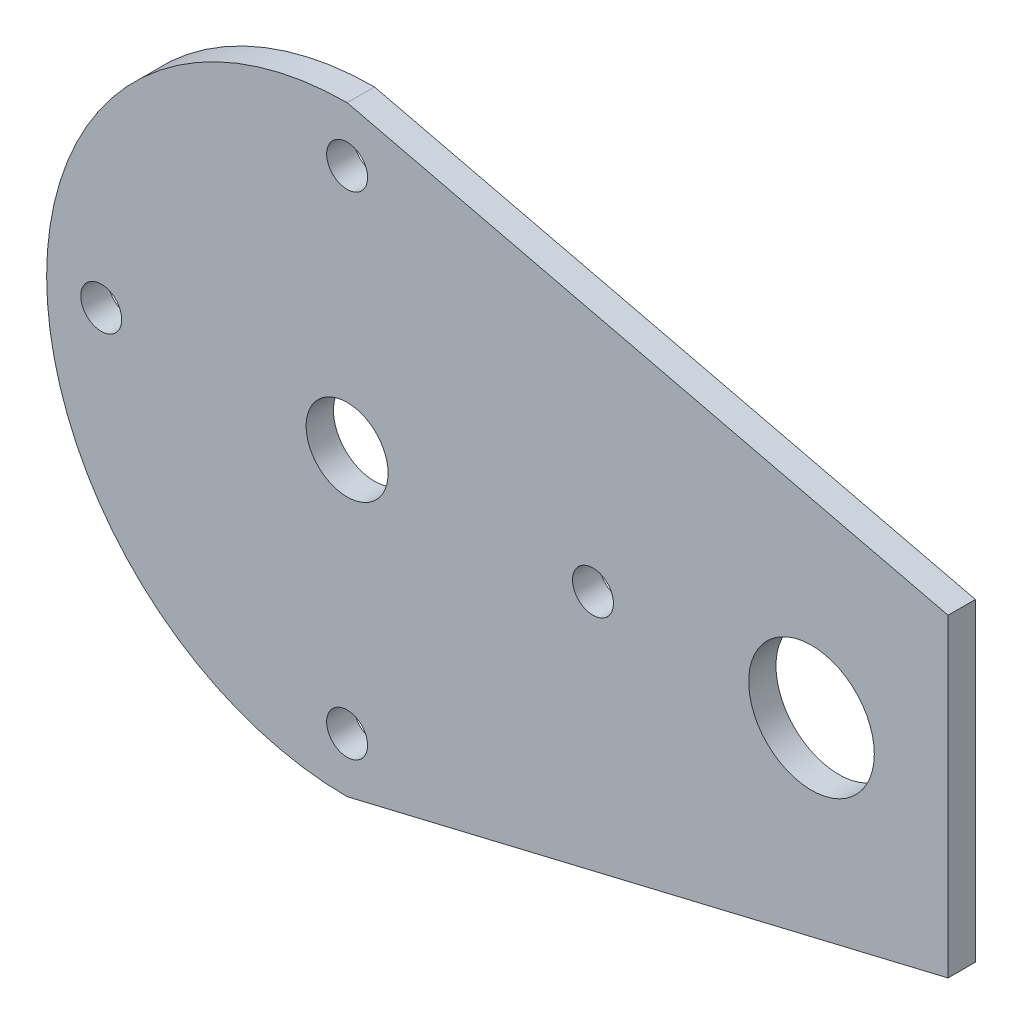
ISO-10303-21;
HEADER;
FILE_DESCRIPTION(('STEP AP214'),'2;1');
FILE_NAME('part.step','',(''),(''),'','','');
FILE_SCHEMA(('AUTOMOTIVE_DESIGN { 1 0 10303 214 1 1 1 1 }'));
ENDSEC;
DATA;
#1=APPLICATION_CONTEXT('core data for automotive mechanical design processes');
#2=APPLICATION_PROTOCOL_DEFINITION('international standard','automotive_design',2000,#1);
#3=PRODUCT_CONTEXT('',#1,'mechanical');
#4=PRODUCT('Part','Part','',(#3));
#5=PRODUCT_RELATED_PRODUCT_CATEGORY('part','',(#4));
#6=PRODUCT_DEFINITION_FORMATION('','',#4);
#7=PRODUCT_DEFINITION_CONTEXT('part definition',#1,'design');
#8=PRODUCT_DEFINITION('design','',#6,#7);
#9=PRODUCT_DEFINITION_SHAPE('','',#8);
#10=(LENGTH_UNIT() NAMED_UNIT(*) SI_UNIT(.MILLI.,.METRE.));
#11=(NAMED_UNIT(*) PLANE_ANGLE_UNIT() SI_UNIT($,.RADIAN.));
#12=(NAMED_UNIT(*) SI_UNIT($,.STERADIAN.) SOLID_ANGLE_UNIT());
#13=UNCERTAINTY_MEASURE_WITH_UNIT(LENGTH_MEASURE(1.E-05),#10,'distance_accuracy_value','');
#14=(GEOMETRIC_REPRESENTATION_CONTEXT(3) GLOBAL_UNCERTAINTY_ASSIGNED_CONTEXT((#13)) GLOBAL_UNIT_ASSIGNED_CONTEXT((#10,
#11,#12)) REPRESENTATION_CONTEXT('',''));
#15=CARTESIAN_POINT('',(0.,0.,0.));
#16=DIRECTION('',(0.,0.,1.));
#17=DIRECTION('',(1.,0.,0.));
#18=AXIS2_PLACEMENT_3D('',#15,#16,#17);
#19=CARTESIAN_POINT('',(2.86640368944242,12.010447034107,2.));
#20=DIRECTION('',(-0.232139621887318,-0.972682474371782,0.));
#21=DIRECTION('',(0.972682474371782,-0.232139621887318,0.));
#22=AXIS2_PLACEMENT_3D('',#19,#20,#21);
#23=PLANE('',#22);
#24=DIRECTION('',(-0.972682474371782,0.232139621887318,0.));
#25=VECTOR('',#24,1.);
#26=CARTESIAN_POINT('',(2.86640368944242,12.010447034107,0.));
#27=LINE('',#26,#25);
#28=CARTESIAN_POINT('',(5.00100483165142,11.5010048316527,0.));
#29=VERTEX_POINT('',#28);
#30=CARTESIAN_POINT('',(-38.9989951683486,22.0020096633054,0.));
#31=VERTEX_POINT('',#30);
#32=EDGE_CURVE('E119',#29,#31,#27,.T.);
#33=ORIENTED_EDGE('',*,*,#32,.T.);
#34=DIRECTION('',(0.,0.,-1.));
#35=VECTOR('',#34,1.);
#36=CARTESIAN_POINT('',(-38.9989951683486,22.0020096633054,2.));
#37=LINE('',#36,#35);
#38=CARTESIAN_POINT('',(-38.9989951683486,22.0020096633054,2.));
#39=VERTEX_POINT('',#38);
#40=EDGE_CURVE('E11',#39,#31,#37,.T.);
#41=ORIENTED_EDGE('',*,*,#40,.F.);
#42=DIRECTION('',(-0.972682474371782,0.232139621887318,0.));
#43=VECTOR('',#42,1.);
#44=CARTESIAN_POINT('',(2.86640368944242,12.010447034107,2.));
#45=LINE('',#44,#43);
#46=CARTESIAN_POINT('',(5.00100483165142,11.5010048316527,2.));
#47=VERTEX_POINT('',#46);
#48=EDGE_CURVE('E87',#47,#39,#45,.T.);
#49=ORIENTED_EDGE('',*,*,#48,.F.);
#50=DIRECTION('',(0.,0.,-1.));
#51=VECTOR('',#50,1.);
#52=CARTESIAN_POINT('',(5.00100483165142,11.5010048316527,2.));
#53=LINE('',#52,#51);
#54=EDGE_CURVE('E54',#47,#29,#53,.T.);
#55=ORIENTED_EDGE('',*,*,#54,.T.);
#56=EDGE_LOOP('',(#33,#41,#49,#55));
#57=FACE_BOUND('',#56,.T.);
#58=ADVANCED_FACE('F37',(#57),#23,.F.);
#59=CARTESIAN_POINT('',(-38.9989951683486,0.,2.));
#60=DIRECTION('',(0.,0.,-1.));
#61=DIRECTION('',(-1.,0.,0.));
#62=AXIS2_PLACEMENT_3D('',#59,#60,#61);
#63=CYLINDRICAL_SURFACE('',#62,22.0020096633054);
#64=CARTESIAN_POINT('',(-38.9989951683486,0.,0.));
#65=DIRECTION('',(0.,0.,1.));
#66=DIRECTION('',(1.,0.,0.));
#67=AXIS2_PLACEMENT_3D('',#64,#65,#66);
#68=CIRCLE('',#67,22.0020096633054);
#69=CARTESIAN_POINT('',(-38.9989951683486,-22.0020096633054,0.));
#70=VERTEX_POINT('',#69);
#71=EDGE_CURVE('E92',#31,#70,#68,.T.);
#72=ORIENTED_EDGE('',*,*,#71,.T.);
#73=DIRECTION('',(0.,0.,-1.));
#74=VECTOR('',#73,1.);
#75=CARTESIAN_POINT('',(-38.9989951683486,-22.0020096633054,2.));
#76=LINE('',#75,#74);
#77=CARTESIAN_POINT('',(-38.9989951683486,-22.0020096633054,2.));
#78=VERTEX_POINT('',#77);
#79=EDGE_CURVE('E46',#78,#70,#76,.T.);
#80=ORIENTED_EDGE('',*,*,#79,.F.);
#81=CARTESIAN_POINT('',(-38.9989951683486,0.,2.));
#82=DIRECTION('',(0.,0.,1.));
#83=DIRECTION('',(1.,0.,0.));
#84=AXIS2_PLACEMENT_3D('',#81,#82,#83);
#85=CIRCLE('',#84,22.0020096633054);
#86=EDGE_CURVE('E79',#39,#78,#85,.T.);
#87=ORIENTED_EDGE('',*,*,#86,.F.);
#88=ORIENTED_EDGE('',*,*,#40,.T.);
#89=EDGE_LOOP('',(#72,#80,#87,#88));
#90=FACE_BOUND('',#89,.T.);
#91=ADVANCED_FACE('F91',(#90),#63,.T.);
#92=CARTESIAN_POINT('',(2.86640368944242,-12.010447034107,2.));
#93=DIRECTION('',(0.232139621887318,-0.972682474371782,0.));
#94=DIRECTION('',(0.972682474371782,0.232139621887318,0.));
#95=AXIS2_PLACEMENT_3D('',#92,#93,#94);
#96=PLANE('',#95);
#97=DIRECTION('',(-0.972682474371782,-0.232139621887318,0.));
#98=VECTOR('',#97,1.);
#99=CARTESIAN_POINT('',(2.86640368944242,-12.010447034107,0.));
#100=LINE('',#99,#98);
#101=CARTESIAN_POINT('',(5.00100483165142,-11.5010048316527,0.));
#102=VERTEX_POINT('',#101);
#103=EDGE_CURVE('E122',#102,#70,#100,.T.);
#104=ORIENTED_EDGE('',*,*,#103,.F.);
#105=DIRECTION('',(0.,0.,-1.));
#106=VECTOR('',#105,1.);
#107=CARTESIAN_POINT('',(5.00100483165142,-11.5010048316527,2.));
#108=LINE('',#107,#106);
#109=CARTESIAN_POINT('',(5.00100483165142,-11.5010048316527,2.));
#110=VERTEX_POINT('',#109);
#111=EDGE_CURVE('E68',#110,#102,#108,.T.);
#112=ORIENTED_EDGE('',*,*,#111,.F.);
#113=DIRECTION('',(-0.972682474371782,-0.232139621887318,0.));
#114=VECTOR('',#113,1.);
#115=CARTESIAN_POINT('',(2.86640368944242,-12.010447034107,2.));
#116=LINE('',#115,#114);
#117=EDGE_CURVE('E86',#110,#78,#116,.T.);
#118=ORIENTED_EDGE('',*,*,#117,.T.);
#119=ORIENTED_EDGE('',*,*,#79,.T.);
#120=EDGE_LOOP('',(#104,#112,#118,#119));
#121=FACE_BOUND('',#120,.T.);
#122=ADVANCED_FACE('F95',(#121),#96,.T.);
#123=CARTESIAN_POINT('',(-38.9989951683486,0.,2.));
#124=DIRECTION('',(0.,0.,-1.));
#125=DIRECTION('',(-1.,0.,0.));
#126=AXIS2_PLACEMENT_3D('',#123,#124,#125);
#127=CYLINDRICAL_SURFACE('',#126,3.);
#128=CARTESIAN_POINT('',(-38.9989951683486,0.,2.));
#129=DIRECTION('',(0.,0.,1.));
#130=DIRECTION('',(1.,0.,0.));
#131=AXIS2_PLACEMENT_3D('',#128,#129,#130);
#132=CIRCLE('',#131,3.);
#133=CARTESIAN_POINT('',(-35.9989951683486,0.,2.));
#134=VERTEX_POINT('',#133);
#135=EDGE_CURVE('E147',#134,#134,#132,.T.);
#136=ORIENTED_EDGE('',*,*,#135,.T.);
#137=EDGE_LOOP('',(#136));
#138=FACE_BOUND('',#137,.T.);
#139=CARTESIAN_POINT('',(-38.9989951683486,0.,0.));
#140=DIRECTION('',(0.,0.,1.));
#141=DIRECTION('',(1.,0.,0.));
#142=AXIS2_PLACEMENT_3D('',#139,#140,#141);
#143=CIRCLE('',#142,3.);
#144=CARTESIAN_POINT('',(-35.9989951683486,0.,0.));
#145=VERTEX_POINT('',#144);
#146=EDGE_CURVE('E116',#145,#145,#143,.T.);
#147=ORIENTED_EDGE('',*,*,#146,.F.);
#148=EDGE_LOOP('',(#147));
#149=FACE_BOUND('',#148,.T.);
#150=ADVANCED_FACE('F151',(#138,#149),#127,.F.);
#151=CARTESIAN_POINT('',(-4.99899516834858,0.,2.));
#152=DIRECTION('',(0.,0.,-1.));
#153=DIRECTION('',(-1.,0.,0.));
#154=AXIS2_PLACEMENT_3D('',#151,#152,#153);
#155=CYLINDRICAL_SURFACE('',#154,4.6);
#156=CARTESIAN_POINT('',(-4.99899516834858,0.,2.));
#157=DIRECTION('',(0.,0.,1.));
#158=DIRECTION('',(1.,0.,0.));
#159=AXIS2_PLACEMENT_3D('',#156,#157,#158);
#160=CIRCLE('',#159,4.6);
#161=CARTESIAN_POINT('',(-0.398995168348585,0.,2.));
#162=VERTEX_POINT('',#161);
#163=EDGE_CURVE('E144',#162,#162,#160,.T.);
#164=ORIENTED_EDGE('',*,*,#163,.T.);
#165=EDGE_LOOP('',(#164));
#166=FACE_BOUND('',#165,.T.);
#167=CARTESIAN_POINT('',(-4.99899516834858,0.,0.));
#168=DIRECTION('',(0.,0.,1.));
#169=DIRECTION('',(1.,0.,0.));
#170=AXIS2_PLACEMENT_3D('',#167,#168,#169);
#171=CIRCLE('',#170,4.6);
#172=CARTESIAN_POINT('',(-0.398995168348585,0.,0.));
#173=VERTEX_POINT('',#172);
#174=EDGE_CURVE('E113',#173,#173,#171,.T.);
#175=ORIENTED_EDGE('',*,*,#174,.F.);
#176=EDGE_LOOP('',(#175));
#177=FACE_BOUND('',#176,.T.);
#178=ADVANCED_FACE('F177',(#166,#177),#155,.F.);
#179=CARTESIAN_POINT('',(-38.9989951683486,-18.0020096633054,2.));
#180=DIRECTION('',(0.,0.,-1.));
#181=DIRECTION('',(-1.,0.,0.));
#182=AXIS2_PLACEMENT_3D('',#179,#180,#181);
#183=CYLINDRICAL_SURFACE('',#182,1.5);
#184=CARTESIAN_POINT('',(-38.9989951683486,-18.0020096633054,2.));
#185=DIRECTION('',(0.,0.,1.));
#186=DIRECTION('',(1.,0.,0.));
#187=AXIS2_PLACEMENT_3D('',#184,#185,#186);
#188=CIRCLE('',#187,1.5);
#189=CARTESIAN_POINT('',(-37.4989951683486,-18.0020096633054,2.));
#190=VERTEX_POINT('',#189);
#191=EDGE_CURVE('E141',#190,#190,#188,.T.);
#192=ORIENTED_EDGE('',*,*,#191,.T.);
#193=EDGE_LOOP('',(#192));
#194=FACE_BOUND('',#193,.T.);
#195=CARTESIAN_POINT('',(-38.9989951683486,-18.0020096633054,0.));
#196=DIRECTION('',(0.,0.,1.));
#197=DIRECTION('',(1.,0.,0.));
#198=AXIS2_PLACEMENT_3D('',#195,#196,#197);
#199=CIRCLE('',#198,1.5);
#200=CARTESIAN_POINT('',(-37.4989951683486,-18.0020096633054,0.));
#201=VERTEX_POINT('',#200);
#202=EDGE_CURVE('E110',#201,#201,#199,.T.);
#203=ORIENTED_EDGE('',*,*,#202,.F.);
#204=EDGE_LOOP('',(#203));
#205=FACE_BOUND('',#204,.T.);
#206=ADVANCED_FACE('F180',(#194,#205),#183,.F.);
#207=CARTESIAN_POINT('',(-38.9989951683486,18.0020096633054,2.));
#208=DIRECTION('',(0.,0.,-1.));
#209=DIRECTION('',(-1.,0.,0.));
#210=AXIS2_PLACEMENT_3D('',#207,#208,#209);
#211=CYLINDRICAL_SURFACE('',#210,1.5);
#212=CARTESIAN_POINT('',(-38.9989951683486,18.0020096633054,2.));
#213=DIRECTION('',(0.,0.,1.));
#214=DIRECTION('',(1.,0.,0.));
#215=AXIS2_PLACEMENT_3D('',#212,#213,#214);
#216=CIRCLE('',#215,1.5);
#217=CARTESIAN_POINT('',(-37.4989951683486,18.0020096633054,2.));
#218=VERTEX_POINT('',#217);
#219=EDGE_CURVE('E136',#218,#218,#216,.T.);
#220=ORIENTED_EDGE('',*,*,#219,.T.);
#221=EDGE_LOOP('',(#220));
#222=FACE_BOUND('',#221,.T.);
#223=CARTESIAN_POINT('',(-38.9989951683486,18.0020096633054,0.));
#224=DIRECTION('',(0.,0.,1.));
#225=DIRECTION('',(1.,0.,0.));
#226=AXIS2_PLACEMENT_3D('',#223,#224,#225);
#227=CIRCLE('',#226,1.5);
#228=CARTESIAN_POINT('',(-37.4989951683486,18.0020096633054,0.));
#229=VERTEX_POINT('',#228);
#230=EDGE_CURVE('E107',#229,#229,#227,.T.);
#231=ORIENTED_EDGE('',*,*,#230,.F.);
#232=EDGE_LOOP('',(#231));
#233=FACE_BOUND('',#232,.T.);
#234=ADVANCED_FACE('F184',(#222,#233),#211,.F.);
#235=CARTESIAN_POINT('',(-57.001004831654,0.,2.));
#236=DIRECTION('',(0.,0.,-1.));
#237=DIRECTION('',(-1.,0.,0.));
#238=AXIS2_PLACEMENT_3D('',#235,#236,#237);
#239=CYLINDRICAL_SURFACE('',#238,1.5);
#240=CARTESIAN_POINT('',(-57.001004831654,0.,2.));
#241=DIRECTION('',(0.,0.,1.));
#242=DIRECTION('',(1.,0.,0.));
#243=AXIS2_PLACEMENT_3D('',#240,#241,#242);
#244=CIRCLE('',#243,1.5);
#245=CARTESIAN_POINT('',(-55.501004831654,0.,2.));
#246=VERTEX_POINT('',#245);
#247=EDGE_CURVE('E131',#246,#246,#244,.T.);
#248=ORIENTED_EDGE('',*,*,#247,.T.);
#249=EDGE_LOOP('',(#248));
#250=FACE_BOUND('',#249,.T.);
#251=CARTESIAN_POINT('',(-57.001004831654,0.,0.));
#252=DIRECTION('',(0.,0.,1.));
#253=DIRECTION('',(1.,0.,0.));
#254=AXIS2_PLACEMENT_3D('',#251,#252,#253);
#255=CIRCLE('',#254,1.5);
#256=CARTESIAN_POINT('',(-55.501004831654,0.,0.));
#257=VERTEX_POINT('',#256);
#258=EDGE_CURVE('E104',#257,#257,#255,.T.);
#259=ORIENTED_EDGE('',*,*,#258,.F.);
#260=EDGE_LOOP('',(#259));
#261=FACE_BOUND('',#260,.T.);
#262=ADVANCED_FACE('F187',(#250,#261),#239,.F.);
#263=CARTESIAN_POINT('',(-20.9969855050432,0.,2.));
#264=DIRECTION('',(0.,0.,-1.));
#265=DIRECTION('',(-1.,0.,0.));
#266=AXIS2_PLACEMENT_3D('',#263,#264,#265);
#267=CYLINDRICAL_SURFACE('',#266,1.5);
#268=CARTESIAN_POINT('',(-20.9969855050432,0.,2.));
#269=DIRECTION('',(0.,0.,1.));
#270=DIRECTION('',(1.,0.,0.));
#271=AXIS2_PLACEMENT_3D('',#268,#269,#270);
#272=CIRCLE('',#271,1.5);
#273=CARTESIAN_POINT('',(-19.4969855050432,0.,2.));
#274=VERTEX_POINT('',#273);
#275=EDGE_CURVE('E127',#274,#274,#272,.T.);
#276=ORIENTED_EDGE('',*,*,#275,.T.);
#277=EDGE_LOOP('',(#276));
#278=FACE_BOUND('',#277,.T.);
#279=CARTESIAN_POINT('',(-20.9969855050432,0.,0.));
#280=DIRECTION('',(0.,0.,1.));
#281=DIRECTION('',(1.,0.,0.));
#282=AXIS2_PLACEMENT_3D('',#279,#280,#281);
#283=CIRCLE('',#282,1.5);
#284=CARTESIAN_POINT('',(-19.4969855050432,0.,0.));
#285=VERTEX_POINT('',#284);
#286=EDGE_CURVE('E101',#285,#285,#283,.T.);
#287=ORIENTED_EDGE('',*,*,#286,.F.);
#288=EDGE_LOOP('',(#287));
#289=FACE_BOUND('',#288,.T.);
#290=ADVANCED_FACE('F39',(#278,#289),#267,.F.);
#291=CARTESIAN_POINT('',(5.00100483165142,0.,2.));
#292=DIRECTION('',(1.,0.,0.));
#293=DIRECTION('',(0.,0.,-1.));
#294=AXIS2_PLACEMENT_3D('',#291,#292,#293);
#295=PLANE('',#294);
#296=DIRECTION('',(0.,-1.,0.));
#297=VECTOR('',#296,1.);
#298=CARTESIAN_POINT('',(5.00100483165142,0.,0.));
#299=LINE('',#298,#297);
#300=EDGE_CURVE('E124',#29,#102,#299,.T.);
#301=ORIENTED_EDGE('',*,*,#300,.F.);
#302=ORIENTED_EDGE('',*,*,#54,.F.);
#303=DIRECTION('',(0.,-1.,0.));
#304=VECTOR('',#303,1.);
#305=CARTESIAN_POINT('',(5.00100483165142,0.,2.));
#306=LINE('',#305,#304);
#307=EDGE_CURVE('E96',#47,#110,#306,.T.);
#308=ORIENTED_EDGE('',*,*,#307,.T.);
#309=ORIENTED_EDGE('',*,*,#111,.T.);
#310=EDGE_LOOP('',(#301,#302,#308,#309));
#311=FACE_BOUND('',#310,.T.);
#312=ADVANCED_FACE('F156',(#311),#295,.T.);
#313=CARTESIAN_POINT('',(0.,0.,2.));
#314=DIRECTION('',(0.,0.,1.));
#315=DIRECTION('',(1.,0.,0.));
#316=AXIS2_PLACEMENT_3D('',#313,#314,#315);
#317=PLANE('',#316);
#318=ORIENTED_EDGE('',*,*,#275,.F.);
#319=EDGE_LOOP('',(#318));
#320=FACE_BOUND('',#319,.T.);
#321=ORIENTED_EDGE('',*,*,#247,.F.);
#322=EDGE_LOOP('',(#321));
#323=FACE_BOUND('',#322,.T.);
#324=ORIENTED_EDGE('',*,*,#219,.F.);
#325=EDGE_LOOP('',(#324));
#326=FACE_BOUND('',#325,.T.);
#327=ORIENTED_EDGE('',*,*,#191,.F.);
#328=EDGE_LOOP('',(#327));
#329=FACE_BOUND('',#328,.T.);
#330=ORIENTED_EDGE('',*,*,#163,.F.);
#331=EDGE_LOOP('',(#330));
#332=FACE_BOUND('',#331,.T.);
#333=ORIENTED_EDGE('',*,*,#135,.F.);
#334=EDGE_LOOP('',(#333));
#335=FACE_BOUND('',#334,.T.);
#336=ORIENTED_EDGE('',*,*,#48,.T.);
#337=ORIENTED_EDGE('',*,*,#86,.T.);
#338=ORIENTED_EDGE('',*,*,#117,.F.);
#339=ORIENTED_EDGE('',*,*,#307,.F.);
#340=EDGE_LOOP('',(#336,#337,#338,#339));
#341=FACE_BOUND('',#340,.T.);
#342=ADVANCED_FACE('F83',(#320,#323,#326,#329,#332,#335,#341),#317,.T.);
#343=CARTESIAN_POINT('',(0.,0.,0.));
#344=DIRECTION('',(0.,0.,1.));
#345=DIRECTION('',(1.,0.,0.));
#346=AXIS2_PLACEMENT_3D('',#343,#344,#345);
#347=PLANE('',#346);
#348=ORIENTED_EDGE('',*,*,#286,.T.);
#349=EDGE_LOOP('',(#348));
#350=FACE_BOUND('',#349,.T.);
#351=ORIENTED_EDGE('',*,*,#258,.T.);
#352=EDGE_LOOP('',(#351));
#353=FACE_BOUND('',#352,.T.);
#354=ORIENTED_EDGE('',*,*,#230,.T.);
#355=EDGE_LOOP('',(#354));
#356=FACE_BOUND('',#355,.T.);
#357=ORIENTED_EDGE('',*,*,#202,.T.);
#358=EDGE_LOOP('',(#357));
#359=FACE_BOUND('',#358,.T.);
#360=ORIENTED_EDGE('',*,*,#174,.T.);
#361=EDGE_LOOP('',(#360));
#362=FACE_BOUND('',#361,.T.);
#363=ORIENTED_EDGE('',*,*,#146,.T.);
#364=EDGE_LOOP('',(#363));
#365=FACE_BOUND('',#364,.T.);
#366=ORIENTED_EDGE('',*,*,#32,.F.);
#367=ORIENTED_EDGE('',*,*,#300,.T.);
#368=ORIENTED_EDGE('',*,*,#103,.T.);
#369=ORIENTED_EDGE('',*,*,#71,.F.);
#370=EDGE_LOOP('',(#366,#367,#368,#369));
#371=FACE_BOUND('',#370,.T.);
#372=ADVANCED_FACE('F155',(#350,#353,#356,#359,#362,#365,#371),#347,.F.);
#373=CLOSED_SHELL('',(#58,#91,#122,#150,#178,#206,#234,#262,#290,#312,#342,#372));
#374=MANIFOLD_SOLID_BREP('B2',#373);
#375=ADVANCED_BREP_SHAPE_REPRESENTATION('',(#18,#374),#14);
#376=SHAPE_DEFINITION_REPRESENTATION(#9,#375);
ENDSEC;
END-ISO-10303-21;
